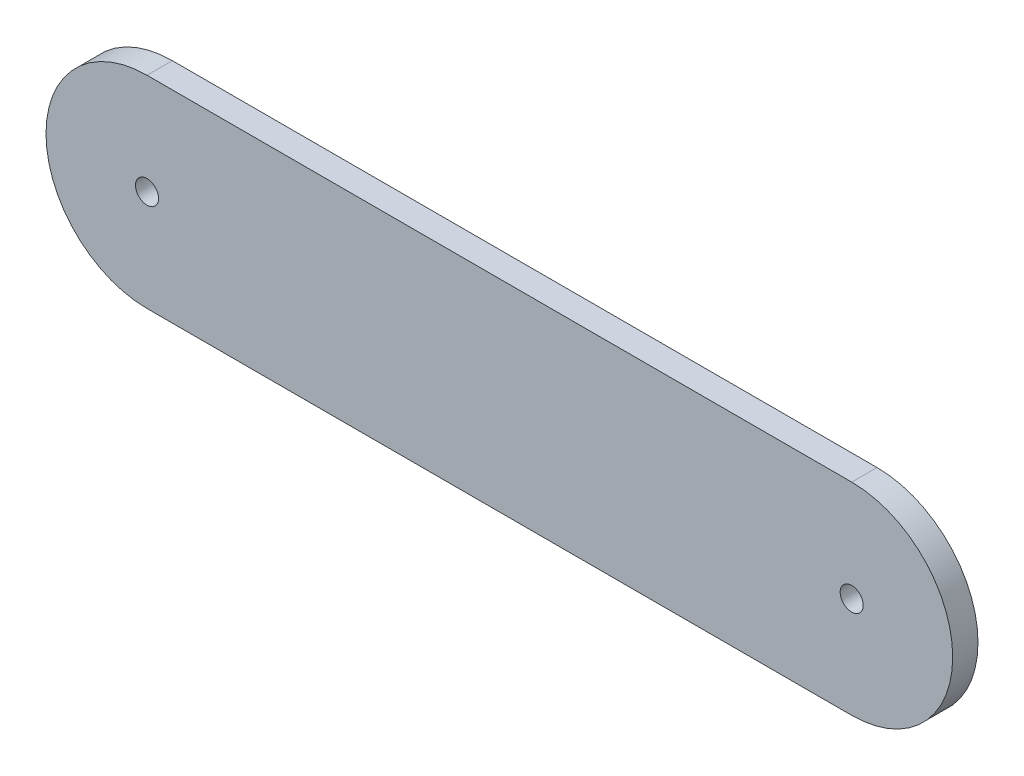
ISO-10303-21;
HEADER;
FILE_DESCRIPTION(('STEP AP214'),'2;1');
FILE_NAME('part.step','',(''),(''),'','','');
FILE_SCHEMA(('AUTOMOTIVE_DESIGN { 1 0 10303 214 1 1 1 1 }'));
ENDSEC;
DATA;
#1=APPLICATION_CONTEXT('core data for automotive mechanical design processes');
#2=APPLICATION_PROTOCOL_DEFINITION('international standard','automotive_design',2000,#1);
#3=PRODUCT_CONTEXT('',#1,'mechanical');
#4=PRODUCT('Part','Part','',(#3));
#5=PRODUCT_RELATED_PRODUCT_CATEGORY('part','',(#4));
#6=PRODUCT_DEFINITION_FORMATION('','',#4);
#7=PRODUCT_DEFINITION_CONTEXT('part definition',#1,'design');
#8=PRODUCT_DEFINITION('design','',#6,#7);
#9=PRODUCT_DEFINITION_SHAPE('','',#8);
#10=(LENGTH_UNIT() NAMED_UNIT(*) SI_UNIT(.MILLI.,.METRE.));
#11=(NAMED_UNIT(*) PLANE_ANGLE_UNIT() SI_UNIT($,.RADIAN.));
#12=(NAMED_UNIT(*) SI_UNIT($,.STERADIAN.) SOLID_ANGLE_UNIT());
#13=UNCERTAINTY_MEASURE_WITH_UNIT(LENGTH_MEASURE(1.E-05),#10,'distance_accuracy_value','');
#14=(GEOMETRIC_REPRESENTATION_CONTEXT(3) GLOBAL_UNCERTAINTY_ASSIGNED_CONTEXT((#13)) GLOBAL_UNIT_ASSIGNED_CONTEXT((#10,
#11,#12)) REPRESENTATION_CONTEXT('',''));
#15=CARTESIAN_POINT('',(0.,0.,0.));
#16=DIRECTION('',(0.,0.,1.));
#17=DIRECTION('',(1.,0.,0.));
#18=AXIS2_PLACEMENT_3D('',#15,#16,#17);
#19=CARTESIAN_POINT('',(0.,0.,3.18));
#20=DIRECTION('',(0.,0.,-1.));
#21=DIRECTION('',(-1.,0.,0.));
#22=AXIS2_PLACEMENT_3D('',#19,#20,#21);
#23=CYLINDRICAL_SURFACE('',#22,12.7);
#24=CARTESIAN_POINT('',(0.,0.,0.));
#25=DIRECTION('',(0.,0.,1.));
#26=DIRECTION('',(-1.,0.,0.));
#27=AXIS2_PLACEMENT_3D('',#24,#25,#26);
#28=CIRCLE('',#27,12.7);
#29=CARTESIAN_POINT('',(0.,12.7,0.));
#30=VERTEX_POINT('',#29);
#31=CARTESIAN_POINT('',(0.,-12.7,0.));
#32=VERTEX_POINT('',#31);
#33=EDGE_CURVE('E107',#30,#32,#28,.T.);
#34=ORIENTED_EDGE('',*,*,#33,.T.);
#35=DIRECTION('',(0.,0.,-1.));
#36=VECTOR('',#35,1.);
#37=CARTESIAN_POINT('',(0.,-12.7,3.18));
#38=LINE('',#37,#36);
#39=CARTESIAN_POINT('',(0.,-12.7,3.18));
#40=VERTEX_POINT('',#39);
#41=EDGE_CURVE('E11',#40,#32,#38,.T.);
#42=ORIENTED_EDGE('',*,*,#41,.F.);
#43=CARTESIAN_POINT('',(0.,0.,3.18));
#44=DIRECTION('',(0.,0.,1.));
#45=DIRECTION('',(-1.,0.,0.));
#46=AXIS2_PLACEMENT_3D('',#43,#44,#45);
#47=CIRCLE('',#46,12.7);
#48=CARTESIAN_POINT('',(0.,12.7,3.18));
#49=VERTEX_POINT('',#48);
#50=EDGE_CURVE('E91',#49,#40,#47,.T.);
#51=ORIENTED_EDGE('',*,*,#50,.F.);
#52=DIRECTION('',(0.,0.,-1.));
#53=VECTOR('',#52,1.);
#54=CARTESIAN_POINT('',(0.,12.7,3.18));
#55=LINE('',#54,#53);
#56=EDGE_CURVE('E103',#49,#30,#55,.T.);
#57=ORIENTED_EDGE('',*,*,#56,.T.);
#58=EDGE_LOOP('',(#34,#42,#51,#57));
#59=FACE_BOUND('',#58,.T.);
#60=ADVANCED_FACE('F39',(#59),#23,.T.);
#61=CARTESIAN_POINT('',(88.6,-12.7,3.18));
#62=DIRECTION('',(0.,1.,0.));
#63=DIRECTION('',(-1.,0.,0.));
#64=AXIS2_PLACEMENT_3D('',#61,#62,#63);
#65=PLANE('',#64);
#66=DIRECTION('',(1.,0.,0.));
#67=VECTOR('',#66,1.);
#68=CARTESIAN_POINT('',(88.6,-12.7,0.));
#69=LINE('',#68,#67);
#70=CARTESIAN_POINT('',(88.6,-12.7,0.));
#71=VERTEX_POINT('',#70);
#72=EDGE_CURVE('E96',#32,#71,#69,.T.);
#73=ORIENTED_EDGE('',*,*,#72,.T.);
#74=DIRECTION('',(0.,0.,-1.));
#75=VECTOR('',#74,1.);
#76=CARTESIAN_POINT('',(88.6,-12.7,3.18));
#77=LINE('',#76,#75);
#78=CARTESIAN_POINT('',(88.6,-12.7,3.18));
#79=VERTEX_POINT('',#78);
#80=EDGE_CURVE('E48',#79,#71,#77,.T.);
#81=ORIENTED_EDGE('',*,*,#80,.F.);
#82=DIRECTION('',(1.,0.,0.));
#83=VECTOR('',#82,1.);
#84=CARTESIAN_POINT('',(88.6,-12.7,3.18));
#85=LINE('',#84,#83);
#86=EDGE_CURVE('E86',#40,#79,#85,.T.);
#87=ORIENTED_EDGE('',*,*,#86,.F.);
#88=ORIENTED_EDGE('',*,*,#41,.T.);
#89=EDGE_LOOP('',(#73,#81,#87,#88));
#90=FACE_BOUND('',#89,.T.);
#91=ADVANCED_FACE('F95',(#90),#65,.F.);
#92=CARTESIAN_POINT('',(88.6,0.,3.18));
#93=DIRECTION('',(0.,0.,-1.));
#94=DIRECTION('',(-1.,0.,0.));
#95=AXIS2_PLACEMENT_3D('',#92,#93,#94);
#96=CYLINDRICAL_SURFACE('',#95,12.7);
#97=CARTESIAN_POINT('',(88.6,0.,0.));
#98=DIRECTION('',(0.,0.,1.));
#99=DIRECTION('',(1.,0.,0.));
#100=AXIS2_PLACEMENT_3D('',#97,#98,#99);
#101=CIRCLE('',#100,12.7);
#102=CARTESIAN_POINT('',(88.6,12.7,0.));
#103=VERTEX_POINT('',#102);
#104=EDGE_CURVE('E73',#71,#103,#101,.T.);
#105=ORIENTED_EDGE('',*,*,#104,.T.);
#106=DIRECTION('',(0.,0.,-1.));
#107=VECTOR('',#106,1.);
#108=CARTESIAN_POINT('',(88.6,12.7,3.18));
#109=LINE('',#108,#107);
#110=CARTESIAN_POINT('',(88.6,12.7,3.18));
#111=VERTEX_POINT('',#110);
#112=EDGE_CURVE('E98',#111,#103,#109,.T.);
#113=ORIENTED_EDGE('',*,*,#112,.F.);
#114=CARTESIAN_POINT('',(88.6,0.,3.18));
#115=DIRECTION('',(0.,0.,1.));
#116=DIRECTION('',(1.,0.,0.));
#117=AXIS2_PLACEMENT_3D('',#114,#115,#116);
#118=CIRCLE('',#117,12.7);
#119=EDGE_CURVE('E89',#79,#111,#118,.T.);
#120=ORIENTED_EDGE('',*,*,#119,.F.);
#121=ORIENTED_EDGE('',*,*,#80,.T.);
#122=EDGE_LOOP('',(#105,#113,#120,#121));
#123=FACE_BOUND('',#122,.T.);
#124=ADVANCED_FACE('F99',(#123),#96,.T.);
#125=CARTESIAN_POINT('',(88.6,12.7,3.18));
#126=DIRECTION('',(0.,-1.,0.));
#127=DIRECTION('',(1.,0.,0.));
#128=AXIS2_PLACEMENT_3D('',#125,#126,#127);
#129=PLANE('',#128);
#130=DIRECTION('',(-1.,0.,0.));
#131=VECTOR('',#130,1.);
#132=CARTESIAN_POINT('',(88.6,12.7,0.));
#133=LINE('',#132,#131);
#134=EDGE_CURVE('E79',#103,#30,#133,.T.);
#135=ORIENTED_EDGE('',*,*,#134,.T.);
#136=ORIENTED_EDGE('',*,*,#56,.F.);
#137=DIRECTION('',(-1.,0.,0.));
#138=VECTOR('',#137,1.);
#139=CARTESIAN_POINT('',(88.6,12.7,3.18));
#140=LINE('',#139,#138);
#141=EDGE_CURVE('E56',#111,#49,#140,.T.);
#142=ORIENTED_EDGE('',*,*,#141,.F.);
#143=ORIENTED_EDGE('',*,*,#112,.T.);
#144=EDGE_LOOP('',(#135,#136,#142,#143));
#145=FACE_BOUND('',#144,.T.);
#146=ADVANCED_FACE('F121',(#145),#129,.F.);
#147=CARTESIAN_POINT('',(0.,0.,3.18));
#148=DIRECTION('',(0.,0.,-1.));
#149=DIRECTION('',(-1.,0.,0.));
#150=AXIS2_PLACEMENT_3D('',#147,#148,#149);
#151=PLANE('',#150);
#152=CARTESIAN_POINT('',(0.,0.,3.18));
#153=DIRECTION('',(0.,0.,1.));
#154=DIRECTION('',(1.,0.,0.));
#155=AXIS2_PLACEMENT_3D('',#152,#153,#154);
#156=CIRCLE('',#155,1.45);
#157=CARTESIAN_POINT('',(1.45,0.,3.18));
#158=VERTEX_POINT('',#157);
#159=EDGE_CURVE('E136',#158,#158,#156,.T.);
#160=ORIENTED_EDGE('',*,*,#159,.F.);
#161=EDGE_LOOP('',(#160));
#162=FACE_BOUND('',#161,.T.);
#163=CARTESIAN_POINT('',(88.6,0.,3.18));
#164=DIRECTION('',(0.,0.,1.));
#165=DIRECTION('',(-1.,0.,0.));
#166=AXIS2_PLACEMENT_3D('',#163,#164,#165);
#167=CIRCLE('',#166,1.45);
#168=CARTESIAN_POINT('',(90.05,0.,3.18));
#169=VERTEX_POINT('',#168);
#170=EDGE_CURVE('E128',#169,#169,#167,.T.);
#171=ORIENTED_EDGE('',*,*,#170,.F.);
#172=EDGE_LOOP('',(#171));
#173=FACE_BOUND('',#172,.T.);
#174=ORIENTED_EDGE('',*,*,#50,.T.);
#175=ORIENTED_EDGE('',*,*,#86,.T.);
#176=ORIENTED_EDGE('',*,*,#119,.T.);
#177=ORIENTED_EDGE('',*,*,#141,.T.);
#178=EDGE_LOOP('',(#174,#175,#176,#177));
#179=FACE_BOUND('',#178,.T.);
#180=ADVANCED_FACE('F87',(#162,#173,#179),#151,.F.);
#181=CARTESIAN_POINT('',(0.,0.,0.));
#182=DIRECTION('',(0.,0.,-1.));
#183=DIRECTION('',(-1.,0.,0.));
#184=AXIS2_PLACEMENT_3D('',#181,#182,#183);
#185=PLANE('',#184);
#186=CARTESIAN_POINT('',(0.,0.,0.));
#187=DIRECTION('',(0.,0.,1.));
#188=DIRECTION('',(1.,0.,0.));
#189=AXIS2_PLACEMENT_3D('',#186,#187,#188);
#190=CIRCLE('',#189,1.45);
#191=CARTESIAN_POINT('',(1.45,0.,0.));
#192=VERTEX_POINT('',#191);
#193=EDGE_CURVE('E111',#192,#192,#190,.T.);
#194=ORIENTED_EDGE('',*,*,#193,.T.);
#195=EDGE_LOOP('',(#194));
#196=FACE_BOUND('',#195,.T.);
#197=CARTESIAN_POINT('',(88.6,0.,0.));
#198=DIRECTION('',(0.,0.,1.));
#199=DIRECTION('',(-1.,0.,0.));
#200=AXIS2_PLACEMENT_3D('',#197,#198,#199);
#201=CIRCLE('',#200,1.45);
#202=CARTESIAN_POINT('',(90.05,0.,0.));
#203=VERTEX_POINT('',#202);
#204=EDGE_CURVE('E132',#203,#203,#201,.T.);
#205=ORIENTED_EDGE('',*,*,#204,.T.);
#206=EDGE_LOOP('',(#205));
#207=FACE_BOUND('',#206,.T.);
#208=ORIENTED_EDGE('',*,*,#33,.F.);
#209=ORIENTED_EDGE('',*,*,#134,.F.);
#210=ORIENTED_EDGE('',*,*,#104,.F.);
#211=ORIENTED_EDGE('',*,*,#72,.F.);
#212=EDGE_LOOP('',(#208,#209,#210,#211));
#213=FACE_BOUND('',#212,.T.);
#214=ADVANCED_FACE('F124',(#196,#207,#213),#185,.T.);
#215=CARTESIAN_POINT('',(88.6,0.,0.));
#216=DIRECTION('',(0.,0.,1.));
#217=DIRECTION('',(1.,0.,0.));
#218=AXIS2_PLACEMENT_3D('',#215,#216,#217);
#219=CYLINDRICAL_SURFACE('',#218,1.45);
#220=CARTESIAN_POINT('',(90.05,0.,0.));
#221=CARTESIAN_POINT('',(90.05,0.,0.033125));
#222=CARTESIAN_POINT('',(90.05,0.,0.06625));
#223=CARTESIAN_POINT('',(90.05,0.,0.1325));
#224=CARTESIAN_POINT('',(90.05,0.,0.165625));
#225=CARTESIAN_POINT('',(90.05,0.,0.231875));
#226=CARTESIAN_POINT('',(90.05,0.,0.265));
#227=CARTESIAN_POINT('',(90.05,0.,0.33125));
#228=CARTESIAN_POINT('',(90.05,0.,0.364375));
#229=CARTESIAN_POINT('',(90.05,0.,0.430625));
#230=CARTESIAN_POINT('',(90.05,0.,0.46375));
#231=CARTESIAN_POINT('',(90.05,0.,0.53));
#232=CARTESIAN_POINT('',(90.05,0.,0.563125));
#233=CARTESIAN_POINT('',(90.05,0.,0.629375));
#234=CARTESIAN_POINT('',(90.05,0.,0.6625));
#235=CARTESIAN_POINT('',(90.05,0.,0.72875));
#236=CARTESIAN_POINT('',(90.05,0.,0.761875));
#237=CARTESIAN_POINT('',(90.05,0.,0.828125));
#238=CARTESIAN_POINT('',(90.05,0.,0.86125));
#239=CARTESIAN_POINT('',(90.05,0.,0.9275));
#240=CARTESIAN_POINT('',(90.05,0.,0.960625));
#241=CARTESIAN_POINT('',(90.05,0.,1.026875));
#242=CARTESIAN_POINT('',(90.05,0.,1.06));
#243=CARTESIAN_POINT('',(90.05,0.,1.12625));
#244=CARTESIAN_POINT('',(90.05,0.,1.159375));
#245=CARTESIAN_POINT('',(90.05,0.,1.225625));
#246=CARTESIAN_POINT('',(90.05,0.,1.25875));
#247=CARTESIAN_POINT('',(90.05,0.,1.325));
#248=CARTESIAN_POINT('',(90.05,0.,1.358125));
#249=CARTESIAN_POINT('',(90.05,0.,1.424375));
#250=CARTESIAN_POINT('',(90.05,0.,1.4575));
#251=CARTESIAN_POINT('',(90.05,0.,1.52375));
#252=CARTESIAN_POINT('',(90.05,0.,1.556875));
#253=CARTESIAN_POINT('',(90.05,0.,1.623125));
#254=CARTESIAN_POINT('',(90.05,0.,1.65625));
#255=CARTESIAN_POINT('',(90.05,0.,1.7225));
#256=CARTESIAN_POINT('',(90.05,0.,1.755625));
#257=CARTESIAN_POINT('',(90.05,0.,1.821875));
#258=CARTESIAN_POINT('',(90.05,0.,1.855));
#259=CARTESIAN_POINT('',(90.05,0.,1.92125));
#260=CARTESIAN_POINT('',(90.05,0.,1.954375));
#261=CARTESIAN_POINT('',(90.05,0.,2.020625));
#262=CARTESIAN_POINT('',(90.05,0.,2.05375));
#263=CARTESIAN_POINT('',(90.05,0.,2.12));
#264=CARTESIAN_POINT('',(90.05,0.,2.153125));
#265=CARTESIAN_POINT('',(90.05,0.,2.219375));
#266=CARTESIAN_POINT('',(90.05,0.,2.2525));
#267=CARTESIAN_POINT('',(90.05,0.,2.31875));
#268=CARTESIAN_POINT('',(90.05,0.,2.351875));
#269=CARTESIAN_POINT('',(90.05,0.,2.418125));
#270=CARTESIAN_POINT('',(90.05,0.,2.45125));
#271=CARTESIAN_POINT('',(90.05,0.,2.5175));
#272=CARTESIAN_POINT('',(90.05,0.,2.550625));
#273=CARTESIAN_POINT('',(90.05,0.,2.616875));
#274=CARTESIAN_POINT('',(90.05,0.,2.65));
#275=CARTESIAN_POINT('',(90.05,0.,2.71625));
#276=CARTESIAN_POINT('',(90.05,0.,2.749375));
#277=CARTESIAN_POINT('',(90.05,0.,2.815625));
#278=CARTESIAN_POINT('',(90.05,0.,2.84875));
#279=CARTESIAN_POINT('',(90.05,0.,2.915));
#280=CARTESIAN_POINT('',(90.05,0.,2.948125));
#281=CARTESIAN_POINT('',(90.05,0.,3.014375));
#282=CARTESIAN_POINT('',(90.05,0.,3.0475));
#283=CARTESIAN_POINT('',(90.05,0.,3.11375));
#284=CARTESIAN_POINT('',(90.05,0.,3.146875));
#285=CARTESIAN_POINT('',(90.05,0.,3.18));
#286=B_SPLINE_CURVE_WITH_KNOTS('',3,(#220,#221,#222,#223,#224,#225,#226,#227,#228,#229,#230,
#231,#232,#233,#234,#235,#236,#237,#238,#239,#240,#241,#242,#243,#244,#245,#246,#247,#248,#249,
#250,#251,#252,#253,#254,#255,#256,#257,#258,#259,#260,#261,#262,#263,#264,#265,#266,#267,#268,
#269,#270,#271,#272,#273,#274,#275,#276,#277,#278,#279,#280,#281,#282,#283,#284,#285),
.UNSPECIFIED.,.F.,.F.,(4,2,2,2,2,2,2,2,2,2,2,2,2,2,2,2,2,2,2,2,2,2,2,2,2,2,2,2,2,2,2,2,4),(0.,
0.099375,0.19875,0.298125,0.3975,0.496875,0.59625,0.695625,0.795,0.894375,0.99375,1.093125,
1.1925,1.291875,1.39125,1.490625,1.59,1.689375,1.78875,1.888125,1.9875,2.086875,2.18625,
2.285625,2.385,2.484375,2.58375,2.683125,2.7825,2.881875,2.98125,3.080625,3.18),.UNSPECIFIED.);
#287=EDGE_CURVE('BSEAM149',#203,#169,#286,.T.);
#288=ORIENTED_EDGE('',*,*,#204,.F.);
#289=ORIENTED_EDGE('',*,*,#170,.T.);
#290=ORIENTED_EDGE('',*,*,#287,.T.);
#291=ORIENTED_EDGE('',*,*,#287,.F.);
#292=EDGE_LOOP('',(#288,#290,#289,#291));
#293=FACE_BOUND('',#292,.T.);
#294=ADVANCED_FACE('F149',(#293),#219,.F.);
#295=CARTESIAN_POINT('',(0.,0.,0.));
#296=DIRECTION('',(0.,0.,1.));
#297=DIRECTION('',(1.,0.,0.));
#298=AXIS2_PLACEMENT_3D('',#295,#296,#297);
#299=CYLINDRICAL_SURFACE('',#298,1.45);
#300=CARTESIAN_POINT('',(1.45,0.,0.));
#301=CARTESIAN_POINT('',(1.45,0.,0.033125));
#302=CARTESIAN_POINT('',(1.45,0.,0.06625));
#303=CARTESIAN_POINT('',(1.45,0.,0.1325));
#304=CARTESIAN_POINT('',(1.45,0.,0.165625));
#305=CARTESIAN_POINT('',(1.45,0.,0.231875));
#306=CARTESIAN_POINT('',(1.45,0.,0.265));
#307=CARTESIAN_POINT('',(1.45,0.,0.33125));
#308=CARTESIAN_POINT('',(1.45,0.,0.364375));
#309=CARTESIAN_POINT('',(1.45,0.,0.430625));
#310=CARTESIAN_POINT('',(1.45,0.,0.46375));
#311=CARTESIAN_POINT('',(1.45,0.,0.53));
#312=CARTESIAN_POINT('',(1.45,0.,0.563125));
#313=CARTESIAN_POINT('',(1.45,0.,0.629375));
#314=CARTESIAN_POINT('',(1.45,0.,0.6625));
#315=CARTESIAN_POINT('',(1.45,0.,0.72875));
#316=CARTESIAN_POINT('',(1.45,0.,0.761875));
#317=CARTESIAN_POINT('',(1.45,0.,0.828125));
#318=CARTESIAN_POINT('',(1.45,0.,0.86125));
#319=CARTESIAN_POINT('',(1.45,0.,0.9275));
#320=CARTESIAN_POINT('',(1.45,0.,0.960625));
#321=CARTESIAN_POINT('',(1.45,0.,1.026875));
#322=CARTESIAN_POINT('',(1.45,0.,1.06));
#323=CARTESIAN_POINT('',(1.45,0.,1.12625));
#324=CARTESIAN_POINT('',(1.45,0.,1.159375));
#325=CARTESIAN_POINT('',(1.45,0.,1.225625));
#326=CARTESIAN_POINT('',(1.45,0.,1.25875));
#327=CARTESIAN_POINT('',(1.45,0.,1.325));
#328=CARTESIAN_POINT('',(1.45,0.,1.358125));
#329=CARTESIAN_POINT('',(1.45,0.,1.424375));
#330=CARTESIAN_POINT('',(1.45,0.,1.4575));
#331=CARTESIAN_POINT('',(1.45,0.,1.52375));
#332=CARTESIAN_POINT('',(1.45,0.,1.556875));
#333=CARTESIAN_POINT('',(1.45,0.,1.623125));
#334=CARTESIAN_POINT('',(1.45,0.,1.65625));
#335=CARTESIAN_POINT('',(1.45,0.,1.7225));
#336=CARTESIAN_POINT('',(1.45,0.,1.755625));
#337=CARTESIAN_POINT('',(1.45,0.,1.821875));
#338=CARTESIAN_POINT('',(1.45,0.,1.855));
#339=CARTESIAN_POINT('',(1.45,0.,1.92125));
#340=CARTESIAN_POINT('',(1.45,0.,1.954375));
#341=CARTESIAN_POINT('',(1.45,0.,2.020625));
#342=CARTESIAN_POINT('',(1.45,0.,2.05375));
#343=CARTESIAN_POINT('',(1.45,0.,2.12));
#344=CARTESIAN_POINT('',(1.45,0.,2.153125));
#345=CARTESIAN_POINT('',(1.45,0.,2.219375));
#346=CARTESIAN_POINT('',(1.45,0.,2.2525));
#347=CARTESIAN_POINT('',(1.45,0.,2.31875));
#348=CARTESIAN_POINT('',(1.45,0.,2.351875));
#349=CARTESIAN_POINT('',(1.45,0.,2.418125));
#350=CARTESIAN_POINT('',(1.45,0.,2.45125));
#351=CARTESIAN_POINT('',(1.45,0.,2.5175));
#352=CARTESIAN_POINT('',(1.45,0.,2.550625));
#353=CARTESIAN_POINT('',(1.45,0.,2.616875));
#354=CARTESIAN_POINT('',(1.45,0.,2.65));
#355=CARTESIAN_POINT('',(1.45,0.,2.71625));
#356=CARTESIAN_POINT('',(1.45,0.,2.749375));
#357=CARTESIAN_POINT('',(1.45,0.,2.815625));
#358=CARTESIAN_POINT('',(1.45,0.,2.84875));
#359=CARTESIAN_POINT('',(1.45,0.,2.915));
#360=CARTESIAN_POINT('',(1.45,0.,2.948125));
#361=CARTESIAN_POINT('',(1.45,0.,3.014375));
#362=CARTESIAN_POINT('',(1.45,0.,3.0475));
#363=CARTESIAN_POINT('',(1.45,0.,3.11375));
#364=CARTESIAN_POINT('',(1.45,0.,3.146875));
#365=CARTESIAN_POINT('',(1.45,0.,3.18));
#366=B_SPLINE_CURVE_WITH_KNOTS('',3,(#300,#301,#302,#303,#304,#305,#306,#307,#308,#309,#310,
#311,#312,#313,#314,#315,#316,#317,#318,#319,#320,#321,#322,#323,#324,#325,#326,#327,#328,#329,
#330,#331,#332,#333,#334,#335,#336,#337,#338,#339,#340,#341,#342,#343,#344,#345,#346,#347,#348,
#349,#350,#351,#352,#353,#354,#355,#356,#357,#358,#359,#360,#361,#362,#363,#364,#365),
.UNSPECIFIED.,.F.,.F.,(4,2,2,2,2,2,2,2,2,2,2,2,2,2,2,2,2,2,2,2,2,2,2,2,2,2,2,2,2,2,2,2,4),(0.,
0.099375,0.19875,0.298125,0.3975,0.496875,0.59625,0.695625,0.795,0.894375,0.99375,1.093125,
1.1925,1.291875,1.39125,1.490625,1.59,1.689375,1.78875,1.888125,1.9875,2.086875,2.18625,
2.285625,2.385,2.484375,2.58375,2.683125,2.7825,2.881875,2.98125,3.080625,3.18),.UNSPECIFIED.);
#367=EDGE_CURVE('BSEAM146',#192,#158,#366,.T.);
#368=ORIENTED_EDGE('',*,*,#193,.F.);
#369=ORIENTED_EDGE('',*,*,#159,.T.);
#370=ORIENTED_EDGE('',*,*,#367,.T.);
#371=ORIENTED_EDGE('',*,*,#367,.F.);
#372=EDGE_LOOP('',(#368,#370,#369,#371));
#373=FACE_BOUND('',#372,.T.);
#374=ADVANCED_FACE('F146',(#373),#299,.F.);
#375=CLOSED_SHELL('',(#60,#91,#124,#146,#180,#214,#294,#374));
#376=MANIFOLD_SOLID_BREP('B2',#375);
#377=ADVANCED_BREP_SHAPE_REPRESENTATION('',(#18,#376),#14);
#378=SHAPE_DEFINITION_REPRESENTATION(#9,#377);
ENDSEC;
END-ISO-10303-21;
